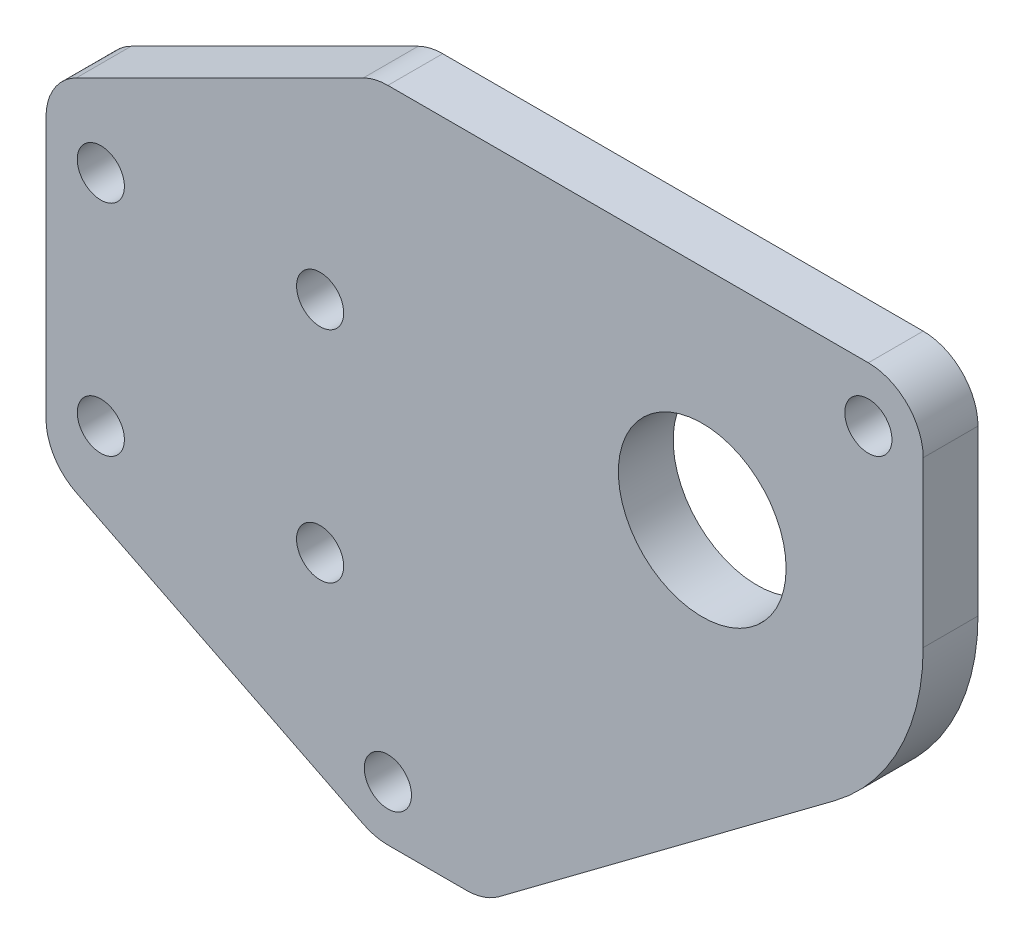
ISO-10303-21;
HEADER;
FILE_DESCRIPTION(('STEP AP214'),'2;1');
FILE_NAME('part.step','',(''),(''),'','','');
FILE_SCHEMA(('AUTOMOTIVE_DESIGN { 1 0 10303 214 1 1 1 1 }'));
ENDSEC;
DATA;
#1=APPLICATION_CONTEXT('core data for automotive mechanical design processes');
#2=APPLICATION_PROTOCOL_DEFINITION('international standard','automotive_design',2000,#1);
#3=PRODUCT_CONTEXT('',#1,'mechanical');
#4=PRODUCT('Part','Part','',(#3));
#5=PRODUCT_RELATED_PRODUCT_CATEGORY('part','',(#4));
#6=PRODUCT_DEFINITION_FORMATION('','',#4);
#7=PRODUCT_DEFINITION_CONTEXT('part definition',#1,'design');
#8=PRODUCT_DEFINITION('design','',#6,#7);
#9=PRODUCT_DEFINITION_SHAPE('','',#8);
#10=(LENGTH_UNIT() NAMED_UNIT(*) SI_UNIT(.MILLI.,.METRE.));
#11=(NAMED_UNIT(*) PLANE_ANGLE_UNIT() SI_UNIT($,.RADIAN.));
#12=(NAMED_UNIT(*) SI_UNIT($,.STERADIAN.) SOLID_ANGLE_UNIT());
#13=UNCERTAINTY_MEASURE_WITH_UNIT(LENGTH_MEASURE(1.E-05),#10,'distance_accuracy_value','');
#14=(GEOMETRIC_REPRESENTATION_CONTEXT(3) GLOBAL_UNCERTAINTY_ASSIGNED_CONTEXT((#13)) GLOBAL_UNIT_ASSIGNED_CONTEXT((#10,
#11,#12)) REPRESENTATION_CONTEXT('',''));
#15=CARTESIAN_POINT('',(0.,0.,0.));
#16=DIRECTION('',(0.,0.,1.));
#17=DIRECTION('',(1.,0.,0.));
#18=AXIS2_PLACEMENT_3D('',#15,#16,#17);
#19=CARTESIAN_POINT('',(0.,0.,5.));
#20=DIRECTION('',(0.,0.,1.));
#21=DIRECTION('',(1.,0.,0.));
#22=AXIS2_PLACEMENT_3D('',#19,#20,#21);
#23=PLANE('',#22);
#24=CARTESIAN_POINT('',(-28.6696601125011,-25.,5.));
#25=DIRECTION('',(0.,0.,1.));
#26=DIRECTION('',(1.,0.,0.));
#27=AXIS2_PLACEMENT_3D('',#24,#25,#26);
#28=CIRCLE('',#27,2.15);
#29=CARTESIAN_POINT('',(-26.5196601125011,-25.,5.));
#30=VERTEX_POINT('',#29);
#31=EDGE_CURVE('E486',#30,#30,#28,.T.);
#32=ORIENTED_EDGE('',*,*,#31,.F.);
#33=EDGE_LOOP('',(#32));
#34=FACE_BOUND('',#33,.T.);
#35=DIRECTION('',(1.,0.,0.));
#36=VECTOR('',#35,1.);
#37=CARTESIAN_POINT('',(0.,-30.,5.));
#38=LINE('',#37,#36);
#39=CARTESIAN_POINT('',(-28.6696601125011,-30.,5.));
#40=VERTEX_POINT('',#39);
#41=CARTESIAN_POINT('',(-21.512486923553,-30.,5.));
#42=VERTEX_POINT('',#41);
#43=EDGE_CURVE('E281',#40,#42,#38,.T.);
#44=ORIENTED_EDGE('',*,*,#43,.T.);
#45=CARTESIAN_POINT('',(-21.512486923553,-25.,5.));
#46=DIRECTION('',(0.,0.,1.));
#47=DIRECTION('',(1.,0.,0.));
#48=AXIS2_PLACEMENT_3D('',#45,#46,#47);
#49=CIRCLE('',#48,5.);
#50=CARTESIAN_POINT('',(-18.5185106579549,-29.004510721803,5.));
#51=VERTEX_POINT('',#50);
#52=EDGE_CURVE('E242',#42,#51,#49,.T.);
#53=ORIENTED_EDGE('',*,*,#52,.T.);
#54=DIRECTION('',(-0.800902144360607,-0.598795253119613,0.));
#55=VECTOR('',#54,1.);
#56=CARTESIAN_POINT('',(7.26996032779568,-9.72373576045203,5.));
#57=LINE('',#56,#55);
#58=CARTESIAN_POINT('',(12.0657243503602,-6.13817820886622,5.));
#59=VERTEX_POINT('',#58);
#60=EDGE_CURVE('E165',#59,#51,#57,.T.);
#61=ORIENTED_EDGE('',*,*,#60,.F.);
#62=CARTESIAN_POINT('',(0.,9.99999999999999,5.));
#63=DIRECTION('',(0.,0.,1.));
#64=DIRECTION('',(1.,0.,0.));
#65=AXIS2_PLACEMENT_3D('',#62,#63,#64);
#66=CIRCLE('',#65,20.15);
#67=CARTESIAN_POINT('',(20.15,10.,5.));
#68=VERTEX_POINT('',#67);
#69=EDGE_CURVE('E260',#59,#68,#66,.T.);
#70=ORIENTED_EDGE('',*,*,#69,.T.);
#71=DIRECTION('',(0.,-1.,0.));
#72=VECTOR('',#71,1.);
#73=CARTESIAN_POINT('',(20.15,0.,5.));
#74=LINE('',#73,#72);
#75=CARTESIAN_POINT('',(20.15,25.,5.));
#76=VERTEX_POINT('',#75);
#77=EDGE_CURVE('E174',#76,#68,#74,.T.);
#78=ORIENTED_EDGE('',*,*,#77,.F.);
#79=CARTESIAN_POINT('',(15.15,25.,5.));
#80=DIRECTION('',(0.,0.,1.));
#81=DIRECTION('',(1.,0.,0.));
#82=AXIS2_PLACEMENT_3D('',#79,#80,#81);
#83=CIRCLE('',#82,5.);
#84=CARTESIAN_POINT('',(15.15,30.,5.));
#85=VERTEX_POINT('',#84);
#86=EDGE_CURVE('E265',#76,#85,#83,.T.);
#87=ORIENTED_EDGE('',*,*,#86,.T.);
#88=DIRECTION('',(1.,0.,0.));
#89=VECTOR('',#88,1.);
#90=CARTESIAN_POINT('',(0.,30.,5.));
#91=LINE('',#90,#89);
#92=CARTESIAN_POINT('',(-28.6696601125011,30.,5.));
#93=VERTEX_POINT('',#92);
#94=EDGE_CURVE('E274',#93,#85,#91,.T.);
#95=ORIENTED_EDGE('',*,*,#94,.F.);
#96=CARTESIAN_POINT('',(-28.6696601125011,25.,5.));
#97=DIRECTION('',(0.,0.,1.));
#98=DIRECTION('',(1.,0.,0.));
#99=AXIS2_PLACEMENT_3D('',#96,#97,#98);
#100=CIRCLE('',#99,5.);
#101=CARTESIAN_POINT('',(-30.9057280900009,29.4721359549996,5.));
#102=VERTEX_POINT('',#101);
#103=EDGE_CURVE('E205',#93,#102,#100,.T.);
#104=ORIENTED_EDGE('',*,*,#103,.T.);
#105=DIRECTION('',(0.894427190999916,0.447213595499958,0.));
#106=VECTOR('',#105,1.);
#107=CARTESIAN_POINT('',(-17.97,35.94,5.));
#108=LINE('',#107,#106);
#109=CARTESIAN_POINT('',(-57.0860679774998,16.3819660112501,5.));
#110=VERTEX_POINT('',#109);
#111=EDGE_CURVE('E219',#110,#102,#108,.T.);
#112=ORIENTED_EDGE('',*,*,#111,.F.);
#113=CARTESIAN_POINT('',(-54.85,11.9098300562505,5.));
#114=DIRECTION('',(0.,0.,1.));
#115=DIRECTION('',(1.,0.,0.));
#116=AXIS2_PLACEMENT_3D('',#113,#114,#115);
#117=CIRCLE('',#116,5.);
#118=CARTESIAN_POINT('',(-59.85,11.9098300562505,5.));
#119=VERTEX_POINT('',#118);
#120=EDGE_CURVE('E208',#110,#119,#117,.T.);
#121=ORIENTED_EDGE('',*,*,#120,.T.);
#122=DIRECTION('',(0.,-1.,0.));
#123=VECTOR('',#122,1.);
#124=CARTESIAN_POINT('',(-59.85,0.,5.));
#125=LINE('',#124,#123);
#126=CARTESIAN_POINT('',(-59.85,-11.9098300562505,5.));
#127=VERTEX_POINT('',#126);
#128=EDGE_CURVE('E278',#119,#127,#125,.T.);
#129=ORIENTED_EDGE('',*,*,#128,.T.);
#130=CARTESIAN_POINT('',(-54.85,-11.9098300562505,5.));
#131=DIRECTION('',(0.,0.,1.));
#132=DIRECTION('',(1.,0.,0.));
#133=AXIS2_PLACEMENT_3D('',#130,#131,#132);
#134=CIRCLE('',#133,5.);
#135=CARTESIAN_POINT('',(-57.0860679774998,-16.3819660112501,5.));
#136=VERTEX_POINT('',#135);
#137=EDGE_CURVE('E243',#127,#136,#134,.T.);
#138=ORIENTED_EDGE('',*,*,#137,.T.);
#139=DIRECTION('',(0.894427190999916,-0.447213595499958,0.));
#140=VECTOR('',#139,1.);
#141=CARTESIAN_POINT('',(-17.97,-35.94,5.));
#142=LINE('',#141,#140);
#143=CARTESIAN_POINT('',(-30.9057280900009,-29.4721359549996,5.));
#144=VERTEX_POINT('',#143);
#145=EDGE_CURVE('E228',#136,#144,#142,.T.);
#146=ORIENTED_EDGE('',*,*,#145,.T.);
#147=CARTESIAN_POINT('',(-28.6696601125011,-25.,5.));
#148=DIRECTION('',(0.,0.,1.));
#149=DIRECTION('',(1.,0.,0.));
#150=AXIS2_PLACEMENT_3D('',#147,#148,#149);
#151=CIRCLE('',#150,5.);
#152=EDGE_CURVE('E239',#144,#40,#151,.T.);
#153=ORIENTED_EDGE('',*,*,#152,.T.);
#154=EDGE_LOOP('',(#44,#53,#61,#70,#78,#87,#95,#104,#112,#121,#129,#138,#146,#153));
#155=FACE_BOUND('',#154,.T.);
#156=CARTESIAN_POINT('',(15.15,25.,5.));
#157=DIRECTION('',(0.,0.,1.));
#158=DIRECTION('',(1.,0.,0.));
#159=AXIS2_PLACEMENT_3D('',#156,#157,#158);
#160=CIRCLE('',#159,2.15);
#161=CARTESIAN_POINT('',(17.3,25.,5.));
#162=VERTEX_POINT('',#161);
#163=EDGE_CURVE('E380',#162,#162,#160,.T.);
#164=ORIENTED_EDGE('',*,*,#163,.F.);
#165=EDGE_LOOP('',(#164));
#166=FACE_BOUND('',#165,.T.);
#167=CARTESIAN_POINT('',(-54.85,-10.,5.));
#168=DIRECTION('',(0.,0.,1.));
#169=DIRECTION('',(-1.,0.,0.));
#170=AXIS2_PLACEMENT_3D('',#167,#168,#169);
#171=CIRCLE('',#170,2.15);
#172=CARTESIAN_POINT('',(-57.,-10.,5.));
#173=VERTEX_POINT('',#172);
#174=EDGE_CURVE('E405',#173,#173,#171,.T.);
#175=ORIENTED_EDGE('',*,*,#174,.F.);
#176=EDGE_LOOP('',(#175));
#177=FACE_BOUND('',#176,.T.);
#178=CARTESIAN_POINT('',(-34.85,10.,5.));
#179=DIRECTION('',(0.,0.,1.));
#180=DIRECTION('',(1.,0.,0.));
#181=AXIS2_PLACEMENT_3D('',#178,#179,#180);
#182=CIRCLE('',#181,2.15);
#183=CARTESIAN_POINT('',(-32.7,10.,5.));
#184=VERTEX_POINT('',#183);
#185=EDGE_CURVE('E391',#184,#184,#182,.T.);
#186=ORIENTED_EDGE('',*,*,#185,.F.);
#187=EDGE_LOOP('',(#186));
#188=FACE_BOUND('',#187,.T.);
#189=CARTESIAN_POINT('',(-34.85,-10.,5.));
#190=DIRECTION('',(0.,0.,1.));
#191=DIRECTION('',(-1.,0.,0.));
#192=AXIS2_PLACEMENT_3D('',#189,#190,#191);
#193=CIRCLE('',#192,2.15);
#194=CARTESIAN_POINT('',(-37.,-10.,5.));
#195=VERTEX_POINT('',#194);
#196=EDGE_CURVE('E384',#195,#195,#193,.T.);
#197=ORIENTED_EDGE('',*,*,#196,.F.);
#198=EDGE_LOOP('',(#197));
#199=FACE_BOUND('',#198,.T.);
#200=CARTESIAN_POINT('',(-54.85,10.,5.));
#201=DIRECTION('',(0.,0.,1.));
#202=DIRECTION('',(1.,0.,0.));
#203=AXIS2_PLACEMENT_3D('',#200,#201,#202);
#204=CIRCLE('',#203,2.15);
#205=CARTESIAN_POINT('',(-52.7,10.,5.));
#206=VERTEX_POINT('',#205);
#207=EDGE_CURVE('E186',#206,#206,#204,.T.);
#208=ORIENTED_EDGE('',*,*,#207,.F.);
#209=EDGE_LOOP('',(#208));
#210=FACE_BOUND('',#209,.T.);
#211=CARTESIAN_POINT('',(0.,9.99999999999999,5.));
#212=DIRECTION('',(0.,0.,1.));
#213=DIRECTION('',(1.,0.,0.));
#214=AXIS2_PLACEMENT_3D('',#211,#212,#213);
#215=CIRCLE('',#214,7.65);
#216=CARTESIAN_POINT('',(7.65,9.99999999999999,5.));
#217=VERTEX_POINT('',#216);
#218=EDGE_CURVE('E188',#217,#217,#215,.T.);
#219=ORIENTED_EDGE('',*,*,#218,.F.);
#220=EDGE_LOOP('',(#219));
#221=FACE_BOUND('',#220,.T.);
#222=ADVANCED_FACE('F52',(#34,#155,#166,#177,#188,#199,#210,#221),#23,.T.);
#223=CARTESIAN_POINT('',(0.,0.,0.));
#224=DIRECTION('',(0.,0.,1.));
#225=DIRECTION('',(1.,0.,0.));
#226=AXIS2_PLACEMENT_3D('',#223,#224,#225);
#227=PLANE('',#226);
#228=CARTESIAN_POINT('',(-28.6696601125011,-25.,0.));
#229=DIRECTION('',(0.,0.,1.));
#230=DIRECTION('',(1.,0.,0.));
#231=AXIS2_PLACEMENT_3D('',#228,#229,#230);
#232=CIRCLE('',#231,2.15);
#233=CARTESIAN_POINT('',(-26.5196601125011,-25.,0.));
#234=VERTEX_POINT('',#233);
#235=EDGE_CURVE('E484',#234,#234,#232,.T.);
#236=ORIENTED_EDGE('',*,*,#235,.T.);
#237=EDGE_LOOP('',(#236));
#238=FACE_BOUND('',#237,.T.);
#239=CARTESIAN_POINT('',(15.15,25.,0.));
#240=DIRECTION('',(0.,0.,1.));
#241=DIRECTION('',(1.,0.,0.));
#242=AXIS2_PLACEMENT_3D('',#239,#240,#241);
#243=CIRCLE('',#242,2.15);
#244=CARTESIAN_POINT('',(17.3,25.,0.));
#245=VERTEX_POINT('',#244);
#246=EDGE_CURVE('E382',#245,#245,#243,.T.);
#247=ORIENTED_EDGE('',*,*,#246,.T.);
#248=EDGE_LOOP('',(#247));
#249=FACE_BOUND('',#248,.T.);
#250=CARTESIAN_POINT('',(-54.85,-10.,0.));
#251=DIRECTION('',(0.,0.,1.));
#252=DIRECTION('',(-1.,0.,0.));
#253=AXIS2_PLACEMENT_3D('',#250,#251,#252);
#254=CIRCLE('',#253,2.15);
#255=CARTESIAN_POINT('',(-57.,-10.,0.));
#256=VERTEX_POINT('',#255);
#257=EDGE_CURVE('E395',#256,#256,#254,.T.);
#258=ORIENTED_EDGE('',*,*,#257,.T.);
#259=EDGE_LOOP('',(#258));
#260=FACE_BOUND('',#259,.T.);
#261=CARTESIAN_POINT('',(-34.85,10.,0.));
#262=DIRECTION('',(0.,0.,1.));
#263=DIRECTION('',(1.,0.,0.));
#264=AXIS2_PLACEMENT_3D('',#261,#262,#263);
#265=CIRCLE('',#264,2.15);
#266=CARTESIAN_POINT('',(-32.7,10.,0.));
#267=VERTEX_POINT('',#266);
#268=EDGE_CURVE('E403',#267,#267,#265,.T.);
#269=ORIENTED_EDGE('',*,*,#268,.T.);
#270=EDGE_LOOP('',(#269));
#271=FACE_BOUND('',#270,.T.);
#272=CARTESIAN_POINT('',(-34.85,-10.,0.));
#273=DIRECTION('',(0.,0.,1.));
#274=DIRECTION('',(-1.,0.,0.));
#275=AXIS2_PLACEMENT_3D('',#272,#273,#274);
#276=CIRCLE('',#275,2.15);
#277=CARTESIAN_POINT('',(-37.,-10.,0.));
#278=VERTEX_POINT('',#277);
#279=EDGE_CURVE('E388',#278,#278,#276,.T.);
#280=ORIENTED_EDGE('',*,*,#279,.T.);
#281=EDGE_LOOP('',(#280));
#282=FACE_BOUND('',#281,.T.);
#283=CARTESIAN_POINT('',(-54.85,10.,0.));
#284=DIRECTION('',(0.,0.,1.));
#285=DIRECTION('',(1.,0.,0.));
#286=AXIS2_PLACEMENT_3D('',#283,#284,#285);
#287=CIRCLE('',#286,2.15);
#288=CARTESIAN_POINT('',(-52.7,10.,0.));
#289=VERTEX_POINT('',#288);
#290=EDGE_CURVE('E181',#289,#289,#287,.T.);
#291=ORIENTED_EDGE('',*,*,#290,.T.);
#292=EDGE_LOOP('',(#291));
#293=FACE_BOUND('',#292,.T.);
#294=CARTESIAN_POINT('',(0.,9.99999999999999,0.));
#295=DIRECTION('',(0.,0.,1.));
#296=DIRECTION('',(1.,0.,0.));
#297=AXIS2_PLACEMENT_3D('',#294,#295,#296);
#298=CIRCLE('',#297,7.65);
#299=CARTESIAN_POINT('',(7.65,9.99999999999999,0.));
#300=VERTEX_POINT('',#299);
#301=EDGE_CURVE('E197',#300,#300,#298,.T.);
#302=ORIENTED_EDGE('',*,*,#301,.T.);
#303=EDGE_LOOP('',(#302));
#304=FACE_BOUND('',#303,.T.);
#305=DIRECTION('',(-0.800902144360607,-0.598795253119613,0.));
#306=VECTOR('',#305,1.);
#307=CARTESIAN_POINT('',(7.26996032779568,-9.72373576045203,0.));
#308=LINE('',#307,#306);
#309=CARTESIAN_POINT('',(12.0657243503602,-6.13817820886622,0.));
#310=VERTEX_POINT('',#309);
#311=CARTESIAN_POINT('',(-18.5185106579549,-29.004510721803,0.));
#312=VERTEX_POINT('',#311);
#313=EDGE_CURVE('E164',#310,#312,#308,.T.);
#314=ORIENTED_EDGE('',*,*,#313,.T.);
#315=CARTESIAN_POINT('',(-21.512486923553,-25.,0.));
#316=DIRECTION('',(0.,0.,1.));
#317=DIRECTION('',(1.,0.,0.));
#318=AXIS2_PLACEMENT_3D('',#315,#316,#317);
#319=CIRCLE('',#318,5.);
#320=CARTESIAN_POINT('',(-21.512486923553,-30.,0.));
#321=VERTEX_POINT('',#320);
#322=EDGE_CURVE('E355',#312,#321,#319,.F.);
#323=ORIENTED_EDGE('',*,*,#322,.T.);
#324=DIRECTION('',(1.,0.,0.));
#325=VECTOR('',#324,1.);
#326=CARTESIAN_POINT('',(0.,-30.,0.));
#327=LINE('',#326,#325);
#328=CARTESIAN_POINT('',(-28.6696601125011,-30.,0.));
#329=VERTEX_POINT('',#328);
#330=EDGE_CURVE('E194',#329,#321,#327,.T.);
#331=ORIENTED_EDGE('',*,*,#330,.F.);
#332=CARTESIAN_POINT('',(-28.6696601125011,-25.,0.));
#333=DIRECTION('',(0.,0.,1.));
#334=DIRECTION('',(1.,0.,0.));
#335=AXIS2_PLACEMENT_3D('',#332,#333,#334);
#336=CIRCLE('',#335,5.);
#337=CARTESIAN_POINT('',(-30.9057280900009,-29.4721359549996,0.));
#338=VERTEX_POINT('',#337);
#339=EDGE_CURVE('E67',#329,#338,#336,.F.);
#340=ORIENTED_EDGE('',*,*,#339,.T.);
#341=DIRECTION('',(0.894427190999916,-0.447213595499958,0.));
#342=VECTOR('',#341,1.);
#343=CARTESIAN_POINT('',(-17.97,-35.94,0.));
#344=LINE('',#343,#342);
#345=CARTESIAN_POINT('',(-57.0860679774998,-16.3819660112501,0.));
#346=VERTEX_POINT('',#345);
#347=EDGE_CURVE('E225',#346,#338,#344,.T.);
#348=ORIENTED_EDGE('',*,*,#347,.F.);
#349=CARTESIAN_POINT('',(-54.85,-11.9098300562505,0.));
#350=DIRECTION('',(0.,0.,1.));
#351=DIRECTION('',(1.,0.,0.));
#352=AXIS2_PLACEMENT_3D('',#349,#350,#351);
#353=CIRCLE('',#352,5.);
#354=CARTESIAN_POINT('',(-59.85,-11.9098300562505,0.));
#355=VERTEX_POINT('',#354);
#356=EDGE_CURVE('E349',#346,#355,#353,.F.);
#357=ORIENTED_EDGE('',*,*,#356,.T.);
#358=DIRECTION('',(0.,-1.,0.));
#359=VECTOR('',#358,1.);
#360=CARTESIAN_POINT('',(-59.85,0.,0.));
#361=LINE('',#360,#359);
#362=CARTESIAN_POINT('',(-59.85,11.9098300562505,0.));
#363=VERTEX_POINT('',#362);
#364=EDGE_CURVE('E183',#363,#355,#361,.T.);
#365=ORIENTED_EDGE('',*,*,#364,.F.);
#366=CARTESIAN_POINT('',(-54.85,11.9098300562505,0.));
#367=DIRECTION('',(0.,0.,1.));
#368=DIRECTION('',(1.,0.,0.));
#369=AXIS2_PLACEMENT_3D('',#366,#367,#368);
#370=CIRCLE('',#369,5.);
#371=CARTESIAN_POINT('',(-57.0860679774998,16.3819660112501,0.));
#372=VERTEX_POINT('',#371);
#373=EDGE_CURVE('E343',#363,#372,#370,.F.);
#374=ORIENTED_EDGE('',*,*,#373,.T.);
#375=DIRECTION('',(0.894427190999916,0.447213595499958,0.));
#376=VECTOR('',#375,1.);
#377=CARTESIAN_POINT('',(-17.97,35.94,0.));
#378=LINE('',#377,#376);
#379=CARTESIAN_POINT('',(-30.9057280900009,29.4721359549996,0.));
#380=VERTEX_POINT('',#379);
#381=EDGE_CURVE('E224',#372,#380,#378,.T.);
#382=ORIENTED_EDGE('',*,*,#381,.T.);
#383=CARTESIAN_POINT('',(-28.6696601125011,25.,0.));
#384=DIRECTION('',(0.,0.,1.));
#385=DIRECTION('',(1.,0.,0.));
#386=AXIS2_PLACEMENT_3D('',#383,#384,#385);
#387=CIRCLE('',#386,5.);
#388=CARTESIAN_POINT('',(-28.6696601125011,30.,0.));
#389=VERTEX_POINT('',#388);
#390=EDGE_CURVE('E350',#380,#389,#387,.F.);
#391=ORIENTED_EDGE('',*,*,#390,.T.);
#392=DIRECTION('',(1.,0.,0.));
#393=VECTOR('',#392,1.);
#394=CARTESIAN_POINT('',(0.,30.,0.));
#395=LINE('',#394,#393);
#396=CARTESIAN_POINT('',(15.15,30.,0.));
#397=VERTEX_POINT('',#396);
#398=EDGE_CURVE('E180',#389,#397,#395,.T.);
#399=ORIENTED_EDGE('',*,*,#398,.T.);
#400=CARTESIAN_POINT('',(15.15,25.,0.));
#401=DIRECTION('',(0.,0.,1.));
#402=DIRECTION('',(1.,0.,0.));
#403=AXIS2_PLACEMENT_3D('',#400,#401,#402);
#404=CIRCLE('',#403,5.);
#405=CARTESIAN_POINT('',(20.15,25.,0.));
#406=VERTEX_POINT('',#405);
#407=EDGE_CURVE('E179',#406,#397,#404,.T.);
#408=ORIENTED_EDGE('',*,*,#407,.F.);
#409=DIRECTION('',(0.,-1.,0.));
#410=VECTOR('',#409,1.);
#411=CARTESIAN_POINT('',(20.15,0.,0.));
#412=LINE('',#411,#410);
#413=CARTESIAN_POINT('',(20.15,10.,0.));
#414=VERTEX_POINT('',#413);
#415=EDGE_CURVE('E172',#406,#414,#412,.T.);
#416=ORIENTED_EDGE('',*,*,#415,.T.);
#417=CARTESIAN_POINT('',(0.,9.99999999999999,0.));
#418=DIRECTION('',(0.,0.,1.));
#419=DIRECTION('',(1.,0.,0.));
#420=AXIS2_PLACEMENT_3D('',#417,#418,#419);
#421=CIRCLE('',#420,20.15);
#422=EDGE_CURVE('E154',#310,#414,#421,.T.);
#423=ORIENTED_EDGE('',*,*,#422,.F.);
#424=EDGE_LOOP('',(#314,#323,#331,#340,#348,#357,#365,#374,#382,#391,#399,#408,#416,#423));
#425=FACE_BOUND('',#424,.T.);
#426=ADVANCED_FACE('F177',(#238,#249,#260,#271,#282,#293,#304,#425),#227,.F.);
#427=CARTESIAN_POINT('',(-59.85,0.,5.));
#428=DIRECTION('',(1.,0.,0.));
#429=DIRECTION('',(0.,1.,0.));
#430=AXIS2_PLACEMENT_3D('',#427,#428,#429);
#431=PLANE('',#430);
#432=ORIENTED_EDGE('',*,*,#364,.T.);
#433=DIRECTION('',(0.,0.,1.));
#434=VECTOR('',#433,1.);
#435=CARTESIAN_POINT('',(-59.85,-11.9098300562505,5.));
#436=LINE('',#435,#434);
#437=EDGE_CURVE('E362',#355,#127,#436,.T.);
#438=ORIENTED_EDGE('',*,*,#437,.T.);
#439=ORIENTED_EDGE('',*,*,#128,.F.);
#440=DIRECTION('',(0.,0.,1.));
#441=VECTOR('',#440,1.);
#442=CARTESIAN_POINT('',(-59.85,11.9098300562505,5.));
#443=LINE('',#442,#441);
#444=EDGE_CURVE('E344',#119,#363,#443,.F.);
#445=ORIENTED_EDGE('',*,*,#444,.T.);
#446=EDGE_LOOP('',(#432,#438,#439,#445));
#447=FACE_BOUND('',#446,.T.);
#448=ADVANCED_FACE('F298',(#447),#431,.F.);
#449=CARTESIAN_POINT('',(0.,-30.,5.));
#450=DIRECTION('',(0.,1.,0.));
#451=DIRECTION('',(0.,0.,1.));
#452=AXIS2_PLACEMENT_3D('',#449,#450,#451);
#453=PLANE('',#452);
#454=ORIENTED_EDGE('',*,*,#330,.T.);
#455=DIRECTION('',(0.,0.,1.));
#456=VECTOR('',#455,1.);
#457=CARTESIAN_POINT('',(-21.512486923553,-30.,5.));
#458=LINE('',#457,#456);
#459=EDGE_CURVE('E202',#321,#42,#458,.T.);
#460=ORIENTED_EDGE('',*,*,#459,.T.);
#461=ORIENTED_EDGE('',*,*,#43,.F.);
#462=DIRECTION('',(0.,0.,1.));
#463=VECTOR('',#462,1.);
#464=CARTESIAN_POINT('',(-28.6696601125011,-30.,0.));
#465=LINE('',#464,#463);
#466=EDGE_CURVE('E200',#40,#329,#465,.F.);
#467=ORIENTED_EDGE('',*,*,#466,.T.);
#468=EDGE_LOOP('',(#454,#460,#461,#467));
#469=FACE_BOUND('',#468,.T.);
#470=ADVANCED_FACE('F309',(#469),#453,.F.);
#471=CARTESIAN_POINT('',(20.15,0.,5.));
#472=DIRECTION('',(1.,0.,0.));
#473=DIRECTION('',(0.,1.,0.));
#474=AXIS2_PLACEMENT_3D('',#471,#472,#473);
#475=PLANE('',#474);
#476=DIRECTION('',(0.,0.,1.));
#477=VECTOR('',#476,1.);
#478=CARTESIAN_POINT('',(20.15,10.,0.));
#479=LINE('',#478,#477);
#480=EDGE_CURVE('E158',#414,#68,#479,.T.);
#481=ORIENTED_EDGE('',*,*,#480,.F.);
#482=ORIENTED_EDGE('',*,*,#415,.F.);
#483=DIRECTION('',(0.,0.,1.));
#484=VECTOR('',#483,1.);
#485=CARTESIAN_POINT('',(20.15,25.,0.));
#486=LINE('',#485,#484);
#487=EDGE_CURVE('E264',#406,#76,#486,.T.);
#488=ORIENTED_EDGE('',*,*,#487,.T.);
#489=ORIENTED_EDGE('',*,*,#77,.T.);
#490=EDGE_LOOP('',(#481,#482,#488,#489));
#491=FACE_BOUND('',#490,.T.);
#492=ADVANCED_FACE('F170',(#491),#475,.T.);
#493=CARTESIAN_POINT('',(0.,30.,5.));
#494=DIRECTION('',(0.,1.,0.));
#495=DIRECTION('',(0.,0.,1.));
#496=AXIS2_PLACEMENT_3D('',#493,#494,#495);
#497=PLANE('',#496);
#498=ORIENTED_EDGE('',*,*,#398,.F.);
#499=DIRECTION('',(0.,0.,1.));
#500=VECTOR('',#499,1.);
#501=CARTESIAN_POINT('',(-28.6696601125011,30.,5.));
#502=LINE('',#501,#500);
#503=EDGE_CURVE('E13',#389,#93,#502,.T.);
#504=ORIENTED_EDGE('',*,*,#503,.T.);
#505=ORIENTED_EDGE('',*,*,#94,.T.);
#506=DIRECTION('',(0.,0.,1.));
#507=VECTOR('',#506,1.);
#508=CARTESIAN_POINT('',(15.15,30.,0.));
#509=LINE('',#508,#507);
#510=EDGE_CURVE('E269',#397,#85,#509,.T.);
#511=ORIENTED_EDGE('',*,*,#510,.F.);
#512=EDGE_LOOP('',(#498,#504,#505,#511));
#513=FACE_BOUND('',#512,.T.);
#514=ADVANCED_FACE('F308',(#513),#497,.T.);
#515=CARTESIAN_POINT('',(0.,9.99999999999999,5.));
#516=DIRECTION('',(0.,0.,-1.));
#517=DIRECTION('',(-1.,0.,0.));
#518=AXIS2_PLACEMENT_3D('',#515,#516,#517);
#519=CYLINDRICAL_SURFACE('',#518,7.65);
#520=ORIENTED_EDGE('',*,*,#218,.T.);
#521=EDGE_LOOP('',(#520));
#522=FACE_BOUND('',#521,.T.);
#523=ORIENTED_EDGE('',*,*,#301,.F.);
#524=EDGE_LOOP('',(#523));
#525=FACE_BOUND('',#524,.T.);
#526=ADVANCED_FACE('F289',(#522,#525),#519,.F.);
#527=CARTESIAN_POINT('',(-54.85,10.,0.));
#528=DIRECTION('',(0.,0.,1.));
#529=DIRECTION('',(1.,0.,0.));
#530=AXIS2_PLACEMENT_3D('',#527,#528,#529);
#531=CYLINDRICAL_SURFACE('',#530,2.15);
#532=ORIENTED_EDGE('',*,*,#290,.F.);
#533=EDGE_LOOP('',(#532));
#534=FACE_BOUND('',#533,.T.);
#535=ORIENTED_EDGE('',*,*,#207,.T.);
#536=EDGE_LOOP('',(#535));
#537=FACE_BOUND('',#536,.T.);
#538=ADVANCED_FACE('F303',(#534,#537),#531,.F.);
#539=CARTESIAN_POINT('',(-34.85,-10.,0.));
#540=DIRECTION('',(0.,0.,1.));
#541=DIRECTION('',(1.,0.,0.));
#542=AXIS2_PLACEMENT_3D('',#539,#540,#541);
#543=CYLINDRICAL_SURFACE('',#542,2.15);
#544=ORIENTED_EDGE('',*,*,#279,.F.);
#545=EDGE_LOOP('',(#544));
#546=FACE_BOUND('',#545,.T.);
#547=ORIENTED_EDGE('',*,*,#196,.T.);
#548=EDGE_LOOP('',(#547));
#549=FACE_BOUND('',#548,.T.);
#550=ADVANCED_FACE('F418',(#546,#549),#543,.F.);
#551=CARTESIAN_POINT('',(-34.85,10.,0.));
#552=DIRECTION('',(0.,0.,1.));
#553=DIRECTION('',(1.,0.,0.));
#554=AXIS2_PLACEMENT_3D('',#551,#552,#553);
#555=CYLINDRICAL_SURFACE('',#554,2.15);
#556=ORIENTED_EDGE('',*,*,#268,.F.);
#557=EDGE_LOOP('',(#556));
#558=FACE_BOUND('',#557,.T.);
#559=ORIENTED_EDGE('',*,*,#185,.T.);
#560=EDGE_LOOP('',(#559));
#561=FACE_BOUND('',#560,.T.);
#562=ADVANCED_FACE('F423',(#558,#561),#555,.F.);
#563=CARTESIAN_POINT('',(-54.85,-10.,0.));
#564=DIRECTION('',(0.,0.,1.));
#565=DIRECTION('',(1.,0.,0.));
#566=AXIS2_PLACEMENT_3D('',#563,#564,#565);
#567=CYLINDRICAL_SURFACE('',#566,2.15);
#568=ORIENTED_EDGE('',*,*,#257,.F.);
#569=EDGE_LOOP('',(#568));
#570=FACE_BOUND('',#569,.T.);
#571=ORIENTED_EDGE('',*,*,#174,.T.);
#572=EDGE_LOOP('',(#571));
#573=FACE_BOUND('',#572,.T.);
#574=ADVANCED_FACE('F433',(#570,#573),#567,.F.);
#575=CARTESIAN_POINT('',(15.15,25.,0.));
#576=DIRECTION('',(0.,0.,1.));
#577=DIRECTION('',(1.,0.,0.));
#578=AXIS2_PLACEMENT_3D('',#575,#576,#577);
#579=CYLINDRICAL_SURFACE('',#578,2.15);
#580=ORIENTED_EDGE('',*,*,#246,.F.);
#581=EDGE_LOOP('',(#580));
#582=FACE_BOUND('',#581,.T.);
#583=ORIENTED_EDGE('',*,*,#163,.T.);
#584=EDGE_LOOP('',(#583));
#585=FACE_BOUND('',#584,.T.);
#586=ADVANCED_FACE('F439',(#582,#585),#579,.F.);
#587=CARTESIAN_POINT('',(15.15,25.,0.));
#588=DIRECTION('',(0.,0.,1.));
#589=DIRECTION('',(1.,0.,0.));
#590=AXIS2_PLACEMENT_3D('',#587,#588,#589);
#591=CYLINDRICAL_SURFACE('',#590,5.);
#592=ORIENTED_EDGE('',*,*,#86,.F.);
#593=ORIENTED_EDGE('',*,*,#487,.F.);
#594=ORIENTED_EDGE('',*,*,#407,.T.);
#595=ORIENTED_EDGE('',*,*,#510,.T.);
#596=EDGE_LOOP('',(#592,#593,#594,#595));
#597=FACE_BOUND('',#596,.T.);
#598=ADVANCED_FACE('F379',(#597),#591,.T.);
#599=CARTESIAN_POINT('',(7.26996032779568,-9.72373576045203,0.));
#600=DIRECTION('',(-0.598795253119613,0.800902144360607,0.));
#601=DIRECTION('',(-0.800902144360607,-0.598795253119613,0.));
#602=AXIS2_PLACEMENT_3D('',#599,#600,#601);
#603=PLANE('',#602);
#604=ORIENTED_EDGE('',*,*,#60,.T.);
#605=DIRECTION('',(0.,0.,1.));
#606=VECTOR('',#605,1.);
#607=CARTESIAN_POINT('',(-18.5185106579549,-29.004510721803,0.));
#608=LINE('',#607,#606);
#609=EDGE_CURVE('E247',#51,#312,#608,.F.);
#610=ORIENTED_EDGE('',*,*,#609,.T.);
#611=ORIENTED_EDGE('',*,*,#313,.F.);
#612=DIRECTION('',(0.,0.,1.));
#613=VECTOR('',#612,1.);
#614=CARTESIAN_POINT('',(12.0657243503602,-6.13817820886622,0.));
#615=LINE('',#614,#613);
#616=EDGE_CURVE('E160',#310,#59,#615,.T.);
#617=ORIENTED_EDGE('',*,*,#616,.T.);
#618=EDGE_LOOP('',(#604,#610,#611,#617));
#619=FACE_BOUND('',#618,.T.);
#620=ADVANCED_FACE('F450',(#619),#603,.F.);
#621=CARTESIAN_POINT('',(0.,9.99999999999999,0.));
#622=DIRECTION('',(0.,0.,1.));
#623=DIRECTION('',(1.,0.,0.));
#624=AXIS2_PLACEMENT_3D('',#621,#622,#623);
#625=CYLINDRICAL_SURFACE('',#624,20.15);
#626=ORIENTED_EDGE('',*,*,#69,.F.);
#627=ORIENTED_EDGE('',*,*,#616,.F.);
#628=ORIENTED_EDGE('',*,*,#422,.T.);
#629=ORIENTED_EDGE('',*,*,#480,.T.);
#630=EDGE_LOOP('',(#626,#627,#628,#629));
#631=FACE_BOUND('',#630,.T.);
#632=ADVANCED_FACE('F157',(#631),#625,.T.);
#633=CARTESIAN_POINT('',(-17.97,-35.94,0.));
#634=DIRECTION('',(-0.447213595499958,-0.894427190999916,0.));
#635=DIRECTION('',(0.894427190999916,-0.447213595499958,0.));
#636=AXIS2_PLACEMENT_3D('',#633,#634,#635);
#637=PLANE('',#636);
#638=ORIENTED_EDGE('',*,*,#347,.T.);
#639=DIRECTION('',(0.,0.,1.));
#640=VECTOR('',#639,1.);
#641=CARTESIAN_POINT('',(-30.9057280900009,-29.4721359549996,5.));
#642=LINE('',#641,#640);
#643=EDGE_CURVE('E358',#338,#144,#642,.T.);
#644=ORIENTED_EDGE('',*,*,#643,.T.);
#645=ORIENTED_EDGE('',*,*,#145,.F.);
#646=DIRECTION('',(0.,0.,1.));
#647=VECTOR('',#646,1.);
#648=CARTESIAN_POINT('',(-57.0860679774998,-16.3819660112501,0.));
#649=LINE('',#648,#647);
#650=EDGE_CURVE('E74',#136,#346,#649,.F.);
#651=ORIENTED_EDGE('',*,*,#650,.T.);
#652=EDGE_LOOP('',(#638,#644,#645,#651));
#653=FACE_BOUND('',#652,.T.);
#654=ADVANCED_FACE('F471',(#653),#637,.T.);
#655=CARTESIAN_POINT('',(-17.97,35.94,0.));
#656=DIRECTION('',(0.447213595499958,-0.894427190999916,0.));
#657=DIRECTION('',(0.894427190999916,0.447213595499958,0.));
#658=AXIS2_PLACEMENT_3D('',#655,#656,#657);
#659=PLANE('',#658);
#660=ORIENTED_EDGE('',*,*,#381,.F.);
#661=DIRECTION('',(0.,0.,1.));
#662=VECTOR('',#661,1.);
#663=CARTESIAN_POINT('',(-57.0860679774998,16.3819660112501,0.));
#664=LINE('',#663,#662);
#665=EDGE_CURVE('E60',#372,#110,#664,.T.);
#666=ORIENTED_EDGE('',*,*,#665,.T.);
#667=ORIENTED_EDGE('',*,*,#111,.T.);
#668=DIRECTION('',(0.,0.,1.));
#669=VECTOR('',#668,1.);
#670=CARTESIAN_POINT('',(-30.9057280900009,29.4721359549996,0.));
#671=LINE('',#670,#669);
#672=EDGE_CURVE('E365',#102,#380,#671,.F.);
#673=ORIENTED_EDGE('',*,*,#672,.T.);
#674=EDGE_LOOP('',(#660,#666,#667,#673));
#675=FACE_BOUND('',#674,.T.);
#676=ADVANCED_FACE('F368',(#675),#659,.F.);
#677=CARTESIAN_POINT('',(-28.6696601125011,-25.,0.));
#678=DIRECTION('',(0.,0.,1.));
#679=DIRECTION('',(1.,0.,0.));
#680=AXIS2_PLACEMENT_3D('',#677,#678,#679);
#681=CYLINDRICAL_SURFACE('',#680,2.15);
#682=ORIENTED_EDGE('',*,*,#235,.F.);
#683=EDGE_LOOP('',(#682));
#684=FACE_BOUND('',#683,.T.);
#685=ORIENTED_EDGE('',*,*,#31,.T.);
#686=EDGE_LOOP('',(#685));
#687=FACE_BOUND('',#686,.T.);
#688=ADVANCED_FACE('F325',(#684,#687),#681,.F.);
#689=CARTESIAN_POINT('',(-21.512486923553,-25.,5.));
#690=DIRECTION('',(0.,0.,1.));
#691=DIRECTION('',(1.,0.,0.));
#692=AXIS2_PLACEMENT_3D('',#689,#690,#691);
#693=CYLINDRICAL_SURFACE('',#692,5.);
#694=ORIENTED_EDGE('',*,*,#322,.F.);
#695=ORIENTED_EDGE('',*,*,#609,.F.);
#696=ORIENTED_EDGE('',*,*,#52,.F.);
#697=ORIENTED_EDGE('',*,*,#459,.F.);
#698=EDGE_LOOP('',(#694,#695,#696,#697));
#699=FACE_BOUND('',#698,.T.);
#700=ADVANCED_FACE('F321',(#699),#693,.T.);
#701=CARTESIAN_POINT('',(-28.6696601125011,-25.,0.));
#702=DIRECTION('',(0.,0.,-1.));
#703=DIRECTION('',(-1.,0.,0.));
#704=AXIS2_PLACEMENT_3D('',#701,#702,#703);
#705=CYLINDRICAL_SURFACE('',#704,5.);
#706=ORIENTED_EDGE('',*,*,#339,.F.);
#707=ORIENTED_EDGE('',*,*,#466,.F.);
#708=ORIENTED_EDGE('',*,*,#152,.F.);
#709=ORIENTED_EDGE('',*,*,#643,.F.);
#710=EDGE_LOOP('',(#706,#707,#708,#709));
#711=FACE_BOUND('',#710,.T.);
#712=ADVANCED_FACE('F324',(#711),#705,.T.);
#713=CARTESIAN_POINT('',(-54.85,-11.9098300562505,5.));
#714=DIRECTION('',(0.,0.,-1.));
#715=DIRECTION('',(-1.,0.,0.));
#716=AXIS2_PLACEMENT_3D('',#713,#714,#715);
#717=CYLINDRICAL_SURFACE('',#716,5.);
#718=ORIENTED_EDGE('',*,*,#356,.F.);
#719=ORIENTED_EDGE('',*,*,#650,.F.);
#720=ORIENTED_EDGE('',*,*,#137,.F.);
#721=ORIENTED_EDGE('',*,*,#437,.F.);
#722=EDGE_LOOP('',(#718,#719,#720,#721));
#723=FACE_BOUND('',#722,.T.);
#724=ADVANCED_FACE('F329',(#723),#717,.T.);
#725=CARTESIAN_POINT('',(-54.85,11.9098300562505,0.));
#726=DIRECTION('',(0.,0.,1.));
#727=DIRECTION('',(1.,0.,0.));
#728=AXIS2_PLACEMENT_3D('',#725,#726,#727);
#729=CYLINDRICAL_SURFACE('',#728,5.);
#730=ORIENTED_EDGE('',*,*,#373,.F.);
#731=ORIENTED_EDGE('',*,*,#444,.F.);
#732=ORIENTED_EDGE('',*,*,#120,.F.);
#733=ORIENTED_EDGE('',*,*,#665,.F.);
#734=EDGE_LOOP('',(#730,#731,#732,#733));
#735=FACE_BOUND('',#734,.T.);
#736=ADVANCED_FACE('F332',(#735),#729,.T.);
#737=CARTESIAN_POINT('',(-28.6696601125011,25.,5.));
#738=DIRECTION('',(0.,0.,-1.));
#739=DIRECTION('',(-1.,0.,0.));
#740=AXIS2_PLACEMENT_3D('',#737,#738,#739);
#741=CYLINDRICAL_SURFACE('',#740,5.);
#742=ORIENTED_EDGE('',*,*,#390,.F.);
#743=ORIENTED_EDGE('',*,*,#672,.F.);
#744=ORIENTED_EDGE('',*,*,#103,.F.);
#745=ORIENTED_EDGE('',*,*,#503,.F.);
#746=EDGE_LOOP('',(#742,#743,#744,#745));
#747=FACE_BOUND('',#746,.T.);
#748=ADVANCED_FACE('F54',(#747),#741,.T.);
#749=CLOSED_SHELL('',(#222,#426,#448,#470,#492,#514,#526,#538,#550,#562,#574,#586,#598,#620,
#632,#654,#676,#688,#700,#712,#724,#736,#748));
#750=MANIFOLD_SOLID_BREP('B2',#749);
#751=ADVANCED_BREP_SHAPE_REPRESENTATION('',(#18,#750),#14);
#752=SHAPE_DEFINITION_REPRESENTATION(#9,#751);
ENDSEC;
END-ISO-10303-21;
